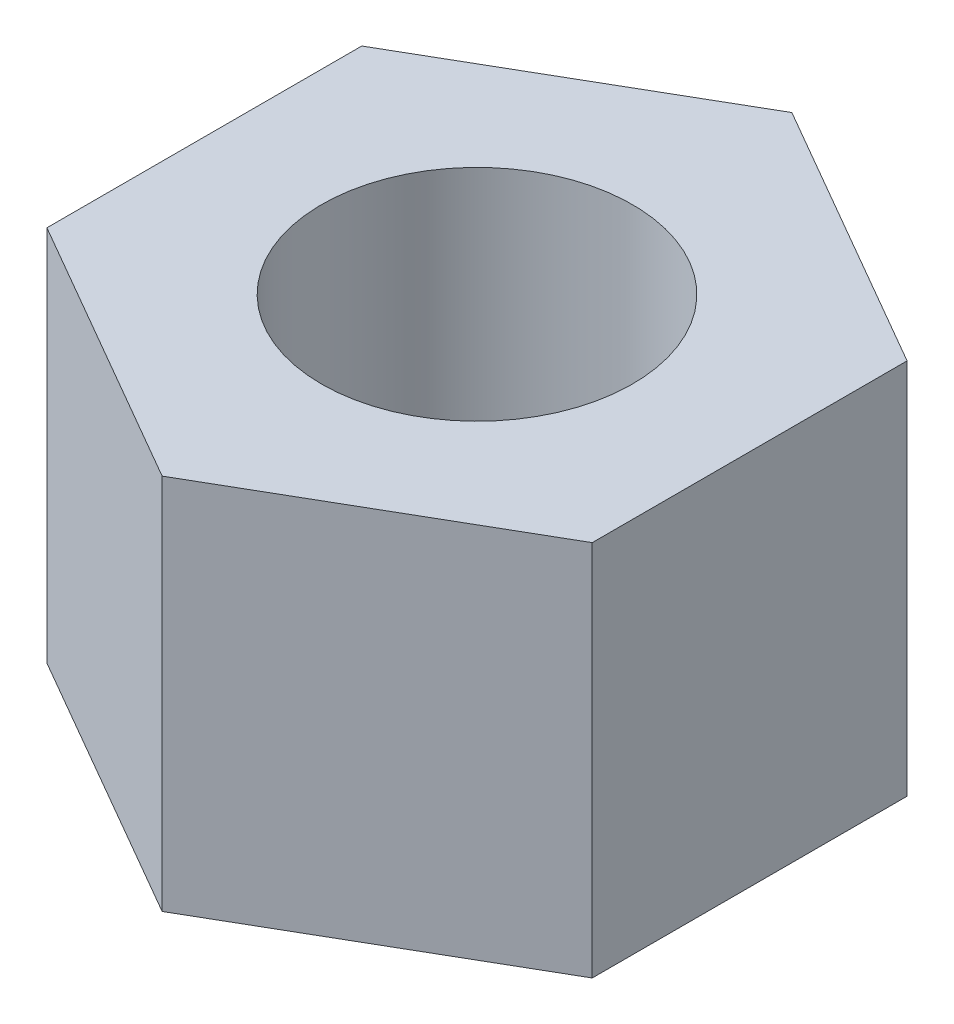
ISO-10303-21;
HEADER;
FILE_DESCRIPTION(('STEP AP214'),'2;1');
FILE_NAME('part.step','',(''),(''),'','','');
FILE_SCHEMA(('AUTOMOTIVE_DESIGN { 1 0 10303 214 1 1 1 1 }'));
ENDSEC;
DATA;
#1=APPLICATION_CONTEXT('core data for automotive mechanical design processes');
#2=APPLICATION_PROTOCOL_DEFINITION('international standard','automotive_design',2000,#1);
#3=PRODUCT_CONTEXT('',#1,'mechanical');
#4=PRODUCT('Part','Part','',(#3));
#5=PRODUCT_RELATED_PRODUCT_CATEGORY('part','',(#4));
#6=PRODUCT_DEFINITION_FORMATION('','',#4);
#7=PRODUCT_DEFINITION_CONTEXT('part definition',#1,'design');
#8=PRODUCT_DEFINITION('design','',#6,#7);
#9=PRODUCT_DEFINITION_SHAPE('','',#8);
#10=(LENGTH_UNIT() NAMED_UNIT(*) SI_UNIT(.MILLI.,.METRE.));
#11=(NAMED_UNIT(*) PLANE_ANGLE_UNIT() SI_UNIT($,.RADIAN.));
#12=(NAMED_UNIT(*) SI_UNIT($,.STERADIAN.) SOLID_ANGLE_UNIT());
#13=UNCERTAINTY_MEASURE_WITH_UNIT(LENGTH_MEASURE(1.E-05),#10,'distance_accuracy_value','');
#14=(GEOMETRIC_REPRESENTATION_CONTEXT(3) GLOBAL_UNCERTAINTY_ASSIGNED_CONTEXT((#13)) GLOBAL_UNIT_ASSIGNED_CONTEXT((#10,
#11,#12)) REPRESENTATION_CONTEXT('',''));
#15=CARTESIAN_POINT('',(0.,0.,0.));
#16=DIRECTION('',(0.,0.,1.));
#17=DIRECTION('',(1.,0.,0.));
#18=AXIS2_PLACEMENT_3D('',#15,#16,#17);
#19=CARTESIAN_POINT('',(0.,4.85,0.));
#20=DIRECTION('',(0.,1.,0.));
#21=DIRECTION('',(0.,0.,1.));
#22=AXIS2_PLACEMENT_3D('',#19,#20,#21);
#23=PLANE('',#22);
#24=DIRECTION('',(0.,0.,-1.));
#25=VECTOR('',#24,1.);
#26=CARTESIAN_POINT('',(3.50740288532698,4.85,2.025));
#27=LINE('',#26,#25);
#28=CARTESIAN_POINT('',(3.50740288532698,4.85,2.025));
#29=VERTEX_POINT('',#28);
#30=CARTESIAN_POINT('',(3.50740288532698,4.85,-2.025));
#31=VERTEX_POINT('',#30);
#32=EDGE_CURVE('E131',#29,#31,#27,.T.);
#33=ORIENTED_EDGE('',*,*,#32,.T.);
#34=DIRECTION('',(-0.866025403784438,0.,-0.5));
#35=VECTOR('',#34,1.);
#36=CARTESIAN_POINT('',(3.50740288532698,4.85,-2.025));
#37=LINE('',#36,#35);
#38=CARTESIAN_POINT('',(0.,4.85,-4.05));
#39=VERTEX_POINT('',#38);
#40=EDGE_CURVE('E89',#31,#39,#37,.T.);
#41=ORIENTED_EDGE('',*,*,#40,.T.);
#42=DIRECTION('',(-0.866025403784439,0.,0.5));
#43=VECTOR('',#42,1.);
#44=CARTESIAN_POINT('',(0.,4.85,-4.05));
#45=LINE('',#44,#43);
#46=CARTESIAN_POINT('',(-3.50740288532698,4.85,-2.025));
#47=VERTEX_POINT('',#46);
#48=EDGE_CURVE('E102',#39,#47,#45,.T.);
#49=ORIENTED_EDGE('',*,*,#48,.T.);
#50=DIRECTION('',(0.,0.,1.));
#51=VECTOR('',#50,1.);
#52=CARTESIAN_POINT('',(-3.50740288532698,4.85,-2.025));
#53=LINE('',#52,#51);
#54=CARTESIAN_POINT('',(-3.50740288532698,4.85,2.025));
#55=VERTEX_POINT('',#54);
#56=EDGE_CURVE('E96',#47,#55,#53,.T.);
#57=ORIENTED_EDGE('',*,*,#56,.T.);
#58=DIRECTION('',(0.866025403784438,0.,0.5));
#59=VECTOR('',#58,1.);
#60=CARTESIAN_POINT('',(-3.50740288532698,4.85,2.025));
#61=LINE('',#60,#59);
#62=CARTESIAN_POINT('',(0.,4.85,4.05));
#63=VERTEX_POINT('',#62);
#64=EDGE_CURVE('E100',#55,#63,#61,.T.);
#65=ORIENTED_EDGE('',*,*,#64,.T.);
#66=DIRECTION('',(0.866025403784439,0.,-0.499999999999999));
#67=VECTOR('',#66,1.);
#68=CARTESIAN_POINT('',(0.,4.85,4.05));
#69=LINE('',#68,#67);
#70=EDGE_CURVE('E52',#63,#29,#69,.T.);
#71=ORIENTED_EDGE('',*,*,#70,.T.);
#72=EDGE_LOOP('',(#33,#41,#49,#57,#65,#71));
#73=FACE_BOUND('',#72,.T.);
#74=CARTESIAN_POINT('',(0.,4.85,0.));
#75=DIRECTION('',(0.,1.,0.));
#76=DIRECTION('',(0.,0.,1.));
#77=AXIS2_PLACEMENT_3D('',#74,#75,#76);
#78=CIRCLE('',#77,2.);
#79=CARTESIAN_POINT('',(0.,4.85,2.));
#80=VERTEX_POINT('',#79);
#81=EDGE_CURVE('E124',#80,#80,#78,.T.);
#82=ORIENTED_EDGE('',*,*,#81,.F.);
#83=EDGE_LOOP('',(#82));
#84=FACE_BOUND('',#83,.T.);
#85=ADVANCED_FACE('F35',(#73,#84),#23,.T.);
#86=CARTESIAN_POINT('',(0.,0.,0.));
#87=DIRECTION('',(0.,1.,0.));
#88=DIRECTION('',(0.,0.,1.));
#89=AXIS2_PLACEMENT_3D('',#86,#87,#88);
#90=PLANE('',#89);
#91=DIRECTION('',(0.,0.,-1.));
#92=VECTOR('',#91,1.);
#93=CARTESIAN_POINT('',(3.50740288532698,0.,2.025));
#94=LINE('',#93,#92);
#95=CARTESIAN_POINT('',(3.50740288532698,0.,2.025));
#96=VERTEX_POINT('',#95);
#97=CARTESIAN_POINT('',(3.50740288532698,0.,-2.025));
#98=VERTEX_POINT('',#97);
#99=EDGE_CURVE('E120',#96,#98,#94,.T.);
#100=ORIENTED_EDGE('',*,*,#99,.F.);
#101=DIRECTION('',(0.866025403784439,0.,-0.499999999999999));
#102=VECTOR('',#101,1.);
#103=CARTESIAN_POINT('',(0.,0.,4.05));
#104=LINE('',#103,#102);
#105=CARTESIAN_POINT('',(0.,0.,4.05));
#106=VERTEX_POINT('',#105);
#107=EDGE_CURVE('E81',#106,#96,#104,.T.);
#108=ORIENTED_EDGE('',*,*,#107,.F.);
#109=DIRECTION('',(0.866025403784438,0.,0.5));
#110=VECTOR('',#109,1.);
#111=CARTESIAN_POINT('',(-3.50740288532698,0.,2.025));
#112=LINE('',#111,#110);
#113=CARTESIAN_POINT('',(-3.50740288532698,0.,2.025));
#114=VERTEX_POINT('',#113);
#115=EDGE_CURVE('E75',#114,#106,#112,.T.);
#116=ORIENTED_EDGE('',*,*,#115,.F.);
#117=DIRECTION('',(0.,0.,1.));
#118=VECTOR('',#117,1.);
#119=CARTESIAN_POINT('',(-3.50740288532698,0.,-2.025));
#120=LINE('',#119,#118);
#121=CARTESIAN_POINT('',(-3.50740288532698,0.,-2.025));
#122=VERTEX_POINT('',#121);
#123=EDGE_CURVE('E110',#122,#114,#120,.T.);
#124=ORIENTED_EDGE('',*,*,#123,.F.);
#125=DIRECTION('',(-0.866025403784439,0.,0.5));
#126=VECTOR('',#125,1.);
#127=CARTESIAN_POINT('',(0.,0.,-4.05));
#128=LINE('',#127,#126);
#129=CARTESIAN_POINT('',(0.,0.,-4.05));
#130=VERTEX_POINT('',#129);
#131=EDGE_CURVE('E126',#130,#122,#128,.T.);
#132=ORIENTED_EDGE('',*,*,#131,.F.);
#133=DIRECTION('',(-0.866025403784438,0.,-0.5));
#134=VECTOR('',#133,1.);
#135=CARTESIAN_POINT('',(3.50740288532698,0.,-2.025));
#136=LINE('',#135,#134);
#137=EDGE_CURVE('E123',#98,#130,#136,.T.);
#138=ORIENTED_EDGE('',*,*,#137,.F.);
#139=EDGE_LOOP('',(#100,#108,#116,#124,#132,#138));
#140=FACE_BOUND('',#139,.T.);
#141=CARTESIAN_POINT('',(0.,0.,0.));
#142=DIRECTION('',(0.,1.,0.));
#143=DIRECTION('',(0.,0.,1.));
#144=AXIS2_PLACEMENT_3D('',#141,#142,#143);
#145=CIRCLE('',#144,2.);
#146=CARTESIAN_POINT('',(0.,0.,2.));
#147=VERTEX_POINT('',#146);
#148=EDGE_CURVE('E224',#147,#147,#145,.T.);
#149=ORIENTED_EDGE('',*,*,#148,.T.);
#150=EDGE_LOOP('',(#149));
#151=FACE_BOUND('',#150,.T.);
#152=ADVANCED_FACE('F140',(#140,#151),#90,.F.);
#153=CARTESIAN_POINT('',(3.50740288532698,4.85,2.025));
#154=DIRECTION('',(-1.,0.,0.));
#155=DIRECTION('',(0.,0.,1.));
#156=AXIS2_PLACEMENT_3D('',#153,#154,#155);
#157=PLANE('',#156);
#158=ORIENTED_EDGE('',*,*,#99,.T.);
#159=DIRECTION('',(0.,-1.,0.));
#160=VECTOR('',#159,1.);
#161=CARTESIAN_POINT('',(3.50740288532698,4.85,-2.025));
#162=LINE('',#161,#160);
#163=EDGE_CURVE('E11',#31,#98,#162,.T.);
#164=ORIENTED_EDGE('',*,*,#163,.F.);
#165=ORIENTED_EDGE('',*,*,#32,.F.);
#166=DIRECTION('',(0.,-1.,0.));
#167=VECTOR('',#166,1.);
#168=CARTESIAN_POINT('',(3.50740288532698,4.85,2.025));
#169=LINE('',#168,#167);
#170=EDGE_CURVE('E116',#29,#96,#169,.T.);
#171=ORIENTED_EDGE('',*,*,#170,.T.);
#172=EDGE_LOOP('',(#158,#164,#165,#171));
#173=FACE_BOUND('',#172,.T.);
#174=ADVANCED_FACE('F37',(#173),#157,.F.);
#175=CARTESIAN_POINT('',(3.50740288532698,4.85,-2.025));
#176=DIRECTION('',(-0.5,0.,0.866025403784438));
#177=DIRECTION('',(0.866025403784438,0.,0.5));
#178=AXIS2_PLACEMENT_3D('',#175,#176,#177);
#179=PLANE('',#178);
#180=ORIENTED_EDGE('',*,*,#137,.T.);
#181=DIRECTION('',(0.,-1.,0.));
#182=VECTOR('',#181,1.);
#183=CARTESIAN_POINT('',(0.,4.85,-4.05));
#184=LINE('',#183,#182);
#185=EDGE_CURVE('E44',#39,#130,#184,.T.);
#186=ORIENTED_EDGE('',*,*,#185,.F.);
#187=ORIENTED_EDGE('',*,*,#40,.F.);
#188=ORIENTED_EDGE('',*,*,#163,.T.);
#189=EDGE_LOOP('',(#180,#186,#187,#188));
#190=FACE_BOUND('',#189,.T.);
#191=ADVANCED_FACE('F165',(#190),#179,.F.);
#192=CARTESIAN_POINT('',(0.,4.85,-4.05));
#193=DIRECTION('',(0.5,0.,0.866025403784439));
#194=DIRECTION('',(0.866025403784439,0.,-0.5));
#195=AXIS2_PLACEMENT_3D('',#192,#193,#194);
#196=PLANE('',#195);
#197=ORIENTED_EDGE('',*,*,#131,.T.);
#198=DIRECTION('',(0.,-1.,0.));
#199=VECTOR('',#198,1.);
#200=CARTESIAN_POINT('',(-3.50740288532698,4.85,-2.025));
#201=LINE('',#200,#199);
#202=EDGE_CURVE('E111',#47,#122,#201,.T.);
#203=ORIENTED_EDGE('',*,*,#202,.F.);
#204=ORIENTED_EDGE('',*,*,#48,.F.);
#205=ORIENTED_EDGE('',*,*,#185,.T.);
#206=EDGE_LOOP('',(#197,#203,#204,#205));
#207=FACE_BOUND('',#206,.T.);
#208=ADVANCED_FACE('F137',(#207),#196,.F.);
#209=CARTESIAN_POINT('',(-3.50740288532698,4.85,-2.025));
#210=DIRECTION('',(1.,0.,0.));
#211=DIRECTION('',(0.,0.,-1.));
#212=AXIS2_PLACEMENT_3D('',#209,#210,#211);
#213=PLANE('',#212);
#214=ORIENTED_EDGE('',*,*,#123,.T.);
#215=DIRECTION('',(0.,-1.,0.));
#216=VECTOR('',#215,1.);
#217=CARTESIAN_POINT('',(-3.50740288532698,4.85,2.025));
#218=LINE('',#217,#216);
#219=EDGE_CURVE('E107',#55,#114,#218,.T.);
#220=ORIENTED_EDGE('',*,*,#219,.F.);
#221=ORIENTED_EDGE('',*,*,#56,.F.);
#222=ORIENTED_EDGE('',*,*,#202,.T.);
#223=EDGE_LOOP('',(#214,#220,#221,#222));
#224=FACE_BOUND('',#223,.T.);
#225=ADVANCED_FACE('F108',(#224),#213,.F.);
#226=CARTESIAN_POINT('',(-3.50740288532698,4.85,2.025));
#227=DIRECTION('',(0.5,0.,-0.866025403784438));
#228=DIRECTION('',(-0.866025403784438,0.,-0.5));
#229=AXIS2_PLACEMENT_3D('',#226,#227,#228);
#230=PLANE('',#229);
#231=ORIENTED_EDGE('',*,*,#115,.T.);
#232=DIRECTION('',(0.,-1.,0.));
#233=VECTOR('',#232,1.);
#234=CARTESIAN_POINT('',(0.,4.85,4.05));
#235=LINE('',#234,#233);
#236=EDGE_CURVE('E112',#63,#106,#235,.T.);
#237=ORIENTED_EDGE('',*,*,#236,.F.);
#238=ORIENTED_EDGE('',*,*,#64,.F.);
#239=ORIENTED_EDGE('',*,*,#219,.T.);
#240=EDGE_LOOP('',(#231,#237,#238,#239));
#241=FACE_BOUND('',#240,.T.);
#242=ADVANCED_FACE('F114',(#241),#230,.F.);
#243=CARTESIAN_POINT('',(0.,4.85,4.05));
#244=DIRECTION('',(-0.499999999999999,0.,-0.866025403784439));
#245=DIRECTION('',(-0.866025403784439,0.,0.499999999999999));
#246=AXIS2_PLACEMENT_3D('',#243,#244,#245);
#247=PLANE('',#246);
#248=ORIENTED_EDGE('',*,*,#107,.T.);
#249=ORIENTED_EDGE('',*,*,#170,.F.);
#250=ORIENTED_EDGE('',*,*,#70,.F.);
#251=ORIENTED_EDGE('',*,*,#236,.T.);
#252=EDGE_LOOP('',(#248,#249,#250,#251));
#253=FACE_BOUND('',#252,.T.);
#254=ADVANCED_FACE('F145',(#253),#247,.F.);
#255=CARTESIAN_POINT('',(0.,4.85,0.));
#256=DIRECTION('',(0.,-1.,0.));
#257=DIRECTION('',(0.,0.,-1.));
#258=AXIS2_PLACEMENT_3D('',#255,#256,#257);
#259=CYLINDRICAL_SURFACE('',#258,2.);
#260=ORIENTED_EDGE('',*,*,#81,.T.);
#261=EDGE_LOOP('',(#260));
#262=FACE_BOUND('',#261,.T.);
#263=ORIENTED_EDGE('',*,*,#148,.F.);
#264=EDGE_LOOP('',(#263));
#265=FACE_BOUND('',#264,.T.);
#266=ADVANCED_FACE('F147',(#262,#265),#259,.F.);
#267=CLOSED_SHELL('',(#85,#152,#174,#191,#208,#225,#242,#254,#266));
#268=MANIFOLD_SOLID_BREP('B2',#267);
#269=ADVANCED_BREP_SHAPE_REPRESENTATION('',(#18,#268),#14);
#270=SHAPE_DEFINITION_REPRESENTATION(#9,#269);
ENDSEC;
END-ISO-10303-21;
